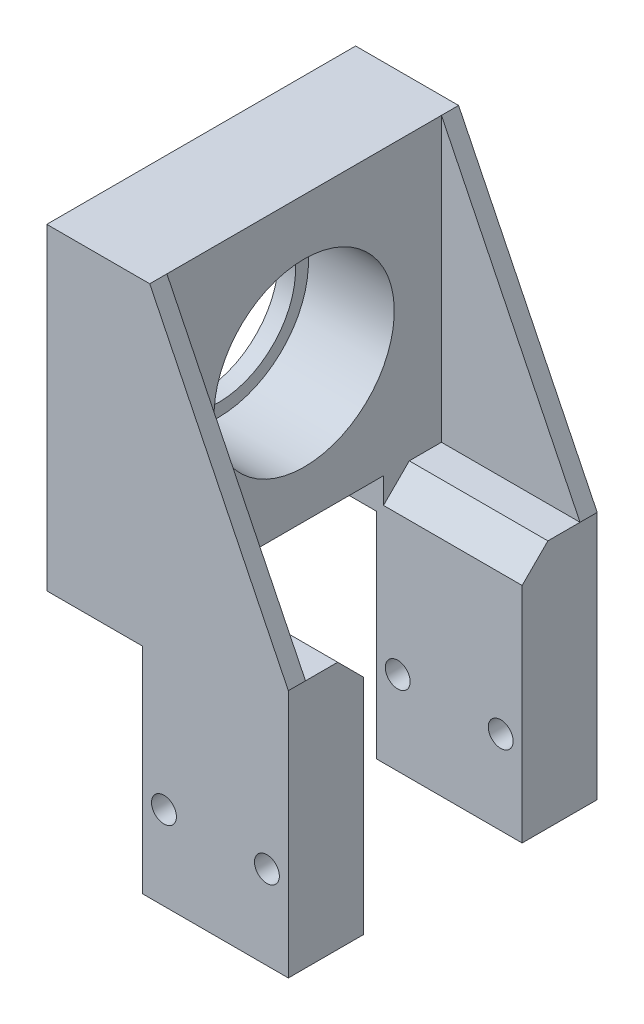
ISO-10303-21;
HEADER;
FILE_DESCRIPTION(('STEP AP214'),'2;1');
FILE_NAME('part.step','',(''),(''),'','','');
FILE_SCHEMA(('AUTOMOTIVE_DESIGN { 1 0 10303 214 1 1 1 1 }'));
ENDSEC;
DATA;
#1=APPLICATION_CONTEXT('core data for automotive mechanical design processes');
#2=APPLICATION_PROTOCOL_DEFINITION('international standard','automotive_design',2000,#1);
#3=PRODUCT_CONTEXT('',#1,'mechanical');
#4=PRODUCT('Part','Part','',(#3));
#5=PRODUCT_RELATED_PRODUCT_CATEGORY('part','',(#4));
#6=PRODUCT_DEFINITION_FORMATION('','',#4);
#7=PRODUCT_DEFINITION_CONTEXT('part definition',#1,'design');
#8=PRODUCT_DEFINITION('design','',#6,#7);
#9=PRODUCT_DEFINITION_SHAPE('','',#8);
#10=(LENGTH_UNIT() NAMED_UNIT(*) SI_UNIT(.MILLI.,.METRE.));
#11=(NAMED_UNIT(*) PLANE_ANGLE_UNIT() SI_UNIT($,.RADIAN.));
#12=(NAMED_UNIT(*) SI_UNIT($,.STERADIAN.) SOLID_ANGLE_UNIT());
#13=UNCERTAINTY_MEASURE_WITH_UNIT(LENGTH_MEASURE(1.E-05),#10,'distance_accuracy_value','');
#14=(GEOMETRIC_REPRESENTATION_CONTEXT(3) GLOBAL_UNCERTAINTY_ASSIGNED_CONTEXT((#13)) GLOBAL_UNIT_ASSIGNED_CONTEXT((#10,
#11,#12)) REPRESENTATION_CONTEXT('',''));
#15=CARTESIAN_POINT('',(0.,0.,0.));
#16=DIRECTION('',(0.,0.,1.));
#17=DIRECTION('',(1.,0.,0.));
#18=AXIS2_PLACEMENT_3D('',#15,#16,#17);
#19=CARTESIAN_POINT('',(-11.1565585331453,62.,36.));
#20=DIRECTION('',(1.,0.,0.));
#21=DIRECTION('',(0.,1.,0.));
#22=AXIS2_PLACEMENT_3D('',#19,#20,#21);
#23=PLANE('',#22);
#24=CARTESIAN_POINT('',(-11.1565585331453,45.,18.));
#25=DIRECTION('',(-1.,0.,0.));
#26=DIRECTION('',(0.,-1.,0.));
#27=AXIS2_PLACEMENT_3D('',#24,#25,#26);
#28=CIRCLE('',#27,9.);
#29=CARTESIAN_POINT('',(-11.1565585331453,36.,18.));
#30=VERTEX_POINT('',#29);
#31=EDGE_CURVE('E370',#30,#30,#28,.T.);
#32=ORIENTED_EDGE('',*,*,#31,.F.);
#33=EDGE_LOOP('',(#32));
#34=FACE_BOUND('',#33,.T.);
#35=CARTESIAN_POINT('',(-11.1565585331453,45.,18.));
#36=DIRECTION('',(-1.,0.,0.));
#37=DIRECTION('',(0.,-1.,0.));
#38=AXIS2_PLACEMENT_3D('',#35,#36,#37);
#39=CIRCLE('',#38,11.);
#40=CARTESIAN_POINT('',(-11.1565585331453,34.,18.));
#41=VERTEX_POINT('',#40);
#42=EDGE_CURVE('E411',#41,#41,#39,.T.);
#43=ORIENTED_EDGE('',*,*,#42,.T.);
#44=EDGE_LOOP('',(#43));
#45=FACE_BOUND('',#44,.T.);
#46=ADVANCED_FACE('F47',(#34,#45),#23,.F.);
#47=CARTESIAN_POINT('',(-11.1565585331453,45.,18.));
#48=DIRECTION('',(1.,0.,0.));
#49=DIRECTION('',(0.,1.,0.));
#50=AXIS2_PLACEMENT_3D('',#47,#48,#49);
#51=CYLINDRICAL_SURFACE('',#50,10.5);
#52=CARTESIAN_POINT('',(0.843441466854715,45.,18.));
#53=DIRECTION('',(1.,0.,0.));
#54=DIRECTION('',(0.,1.,0.));
#55=AXIS2_PLACEMENT_3D('',#52,#53,#54);
#56=CIRCLE('',#55,10.5);
#57=CARTESIAN_POINT('',(0.843441466854713,55.5,18.));
#58=VERTEX_POINT('',#57);
#59=EDGE_CURVE('E279',#58,#58,#56,.T.);
#60=ORIENTED_EDGE('',*,*,#59,.T.);
#61=EDGE_LOOP('',(#60));
#62=FACE_BOUND('',#61,.T.);
#63=CARTESIAN_POINT('',(-9.15655853314528,45.,18.));
#64=DIRECTION('',(-1.,0.,0.));
#65=DIRECTION('',(0.,-1.,0.));
#66=AXIS2_PLACEMENT_3D('',#63,#64,#65);
#67=CIRCLE('',#66,10.5);
#68=CARTESIAN_POINT('',(-9.15655853314528,34.5,18.));
#69=VERTEX_POINT('',#68);
#70=EDGE_CURVE('E11',#69,#69,#67,.F.);
#71=ORIENTED_EDGE('',*,*,#70,.F.);
#72=EDGE_LOOP('',(#71));
#73=FACE_BOUND('',#72,.T.);
#74=ADVANCED_FACE('F481',(#62,#73),#51,.F.);
#75=CARTESIAN_POINT('',(0.843441466854722,29.,36.));
#76=DIRECTION('',(-1.,0.,0.));
#77=DIRECTION('',(0.,0.,1.));
#78=AXIS2_PLACEMENT_3D('',#75,#76,#77);
#79=PLANE('',#78);
#80=ORIENTED_EDGE('',*,*,#59,.F.);
#81=EDGE_LOOP('',(#80));
#82=FACE_BOUND('',#81,.T.);
#83=DIRECTION('',(0.,-1.,0.));
#84=VECTOR('',#83,1.);
#85=CARTESIAN_POINT('',(0.843441466854722,29.,2.));
#86=LINE('',#85,#84);
#87=CARTESIAN_POINT('',(0.843441466854722,62.,2.));
#88=VERTEX_POINT('',#87);
#89=CARTESIAN_POINT('',(0.843441466854722,29.,2.));
#90=VERTEX_POINT('',#89);
#91=EDGE_CURVE('E350',#88,#90,#86,.T.);
#92=ORIENTED_EDGE('',*,*,#91,.F.);
#93=DIRECTION('',(0.,0.,-1.));
#94=VECTOR('',#93,1.);
#95=CARTESIAN_POINT('',(0.843441466854722,62.,36.));
#96=LINE('',#95,#94);
#97=CARTESIAN_POINT('',(0.843441466854722,62.,34.));
#98=VERTEX_POINT('',#97);
#99=EDGE_CURVE('E243',#98,#88,#96,.T.);
#100=ORIENTED_EDGE('',*,*,#99,.F.);
#101=DIRECTION('',(0.,1.,0.));
#102=VECTOR('',#101,1.);
#103=CARTESIAN_POINT('',(0.843441466854722,29.,34.));
#104=LINE('',#103,#102);
#105=CARTESIAN_POINT('',(0.843441466854722,29.,34.));
#106=VERTEX_POINT('',#105);
#107=EDGE_CURVE('E198',#106,#98,#104,.T.);
#108=ORIENTED_EDGE('',*,*,#107,.F.);
#109=DIRECTION('',(0.,0.,-1.));
#110=VECTOR('',#109,1.);
#111=CARTESIAN_POINT('',(0.843441466854722,29.,36.));
#112=LINE('',#111,#110);
#113=CARTESIAN_POINT('',(0.843441466854722,29.,30.25));
#114=VERTEX_POINT('',#113);
#115=EDGE_CURVE('E227',#106,#114,#112,.T.);
#116=ORIENTED_EDGE('',*,*,#115,.T.);
#117=DIRECTION('',(0.,0.707106781186547,0.707106781186548));
#118=VECTOR('',#117,1.);
#119=CARTESIAN_POINT('',(0.843441466854722,31.875,33.125));
#120=LINE('',#119,#118);
#121=CARTESIAN_POINT('',(0.843441466854722,26.,27.25));
#122=VERTEX_POINT('',#121);
#123=EDGE_CURVE('E536',#114,#122,#120,.F.);
#124=ORIENTED_EDGE('',*,*,#123,.T.);
#125=DIRECTION('',(0.,-1.,0.));
#126=VECTOR('',#125,1.);
#127=CARTESIAN_POINT('',(0.843441466854722,0.,27.25));
#128=LINE('',#127,#126);
#129=CARTESIAN_POINT('',(0.843441466854722,29.,27.25));
#130=VERTEX_POINT('',#129);
#131=EDGE_CURVE('E66',#130,#122,#128,.T.);
#132=ORIENTED_EDGE('',*,*,#131,.F.);
#133=DIRECTION('',(0.,0.,-1.));
#134=VECTOR('',#133,1.);
#135=CARTESIAN_POINT('',(0.843441466854722,29.,36.));
#136=LINE('',#135,#134);
#137=CARTESIAN_POINT('',(0.843441466854722,29.,8.75));
#138=VERTEX_POINT('',#137);
#139=EDGE_CURVE('E295',#130,#138,#136,.T.);
#140=ORIENTED_EDGE('',*,*,#139,.T.);
#141=DIRECTION('',(0.,1.,0.));
#142=VECTOR('',#141,1.);
#143=CARTESIAN_POINT('',(0.843441466854722,0.,8.75));
#144=LINE('',#143,#142);
#145=CARTESIAN_POINT('',(0.843441466854722,26.,8.75));
#146=VERTEX_POINT('',#145);
#147=EDGE_CURVE('E72',#146,#138,#144,.T.);
#148=ORIENTED_EDGE('',*,*,#147,.F.);
#149=DIRECTION('',(0.,-0.707106781186548,0.707106781186547));
#150=VECTOR('',#149,1.);
#151=CARTESIAN_POINT('',(0.843441466854722,13.875,20.875));
#152=LINE('',#151,#150);
#153=CARTESIAN_POINT('',(0.843441466854722,29.,5.75));
#154=VERTEX_POINT('',#153);
#155=EDGE_CURVE('E58',#146,#154,#152,.F.);
#156=ORIENTED_EDGE('',*,*,#155,.T.);
#157=EDGE_CURVE('E235',#154,#90,#112,.T.);
#158=ORIENTED_EDGE('',*,*,#157,.T.);
#159=EDGE_LOOP('',(#92,#100,#108,#116,#124,#132,#140,#148,#156,#158));
#160=FACE_BOUND('',#159,.T.);
#161=ADVANCED_FACE('F486',(#82,#160),#79,.F.);
#162=CARTESIAN_POINT('',(17.,29.,36.));
#163=DIRECTION('',(0.,-1.,0.));
#164=DIRECTION('',(0.,0.,-1.));
#165=AXIS2_PLACEMENT_3D('',#162,#163,#164);
#166=PLANE('',#165);
#167=ORIENTED_EDGE('',*,*,#157,.F.);
#168=DIRECTION('',(1.,0.,0.));
#169=VECTOR('',#168,1.);
#170=CARTESIAN_POINT('',(17.,29.,5.75));
#171=LINE('',#170,#169);
#172=CARTESIAN_POINT('',(17.,29.,5.75));
#173=VERTEX_POINT('',#172);
#174=EDGE_CURVE('E553',#154,#173,#171,.T.);
#175=ORIENTED_EDGE('',*,*,#174,.T.);
#176=DIRECTION('',(0.,0.,-1.));
#177=VECTOR('',#176,1.);
#178=CARTESIAN_POINT('',(17.,29.,36.));
#179=LINE('',#178,#177);
#180=CARTESIAN_POINT('',(17.,29.,2.));
#181=VERTEX_POINT('',#180);
#182=EDGE_CURVE('E220',#173,#181,#179,.T.);
#183=ORIENTED_EDGE('',*,*,#182,.T.);
#184=DIRECTION('',(1.,0.,0.));
#185=VECTOR('',#184,1.);
#186=CARTESIAN_POINT('',(17.,29.,2.));
#187=LINE('',#186,#185);
#188=EDGE_CURVE('E345',#90,#181,#187,.T.);
#189=ORIENTED_EDGE('',*,*,#188,.F.);
#190=EDGE_LOOP('',(#167,#175,#183,#189));
#191=FACE_BOUND('',#190,.T.);
#192=ADVANCED_FACE('F500',(#191),#166,.F.);
#193=CARTESIAN_POINT('',(17.,29.,34.));
#194=VERTEX_POINT('',#193);
#195=CARTESIAN_POINT('',(17.,29.,30.25));
#196=VERTEX_POINT('',#195);
#197=EDGE_CURVE('E216',#194,#196,#179,.T.);
#198=ORIENTED_EDGE('',*,*,#197,.T.);
#199=DIRECTION('',(-1.,0.,0.));
#200=VECTOR('',#199,1.);
#201=CARTESIAN_POINT('',(17.,29.,30.25));
#202=LINE('',#201,#200);
#203=EDGE_CURVE('E537',#196,#114,#202,.T.);
#204=ORIENTED_EDGE('',*,*,#203,.T.);
#205=ORIENTED_EDGE('',*,*,#115,.F.);
#206=DIRECTION('',(-1.,0.,0.));
#207=VECTOR('',#206,1.);
#208=CARTESIAN_POINT('',(17.,29.,34.));
#209=LINE('',#208,#207);
#210=EDGE_CURVE('E329',#194,#106,#209,.T.);
#211=ORIENTED_EDGE('',*,*,#210,.F.);
#212=EDGE_LOOP('',(#198,#204,#205,#211));
#213=FACE_BOUND('',#212,.T.);
#214=ADVANCED_FACE('F504',(#213),#166,.F.);
#215=CARTESIAN_POINT('',(0.,25.,36.));
#216=DIRECTION('',(1.,0.,0.));
#217=DIRECTION('',(0.,1.,0.));
#218=AXIS2_PLACEMENT_3D('',#215,#216,#217);
#219=PLANE('',#218);
#220=DIRECTION('',(0.,0.,-1.));
#221=VECTOR('',#220,1.);
#222=CARTESIAN_POINT('',(0.,25.,36.));
#223=LINE('',#222,#221);
#224=CARTESIAN_POINT('',(0.,25.,36.));
#225=VERTEX_POINT('',#224);
#226=CARTESIAN_POINT('',(0.,25.,27.25));
#227=VERTEX_POINT('',#226);
#228=EDGE_CURVE('E251',#225,#227,#223,.T.);
#229=ORIENTED_EDGE('',*,*,#228,.T.);
#230=DIRECTION('',(0.,-1.,0.));
#231=VECTOR('',#230,1.);
#232=CARTESIAN_POINT('',(0.,25.,27.25));
#233=LINE('',#232,#231);
#234=CARTESIAN_POINT('',(0.,0.,27.25));
#235=VERTEX_POINT('',#234);
#236=EDGE_CURVE('E298',#227,#235,#233,.T.);
#237=ORIENTED_EDGE('',*,*,#236,.T.);
#238=DIRECTION('',(0.,0.,-1.));
#239=VECTOR('',#238,1.);
#240=CARTESIAN_POINT('',(0.,0.,36.));
#241=LINE('',#240,#239);
#242=CARTESIAN_POINT('',(0.,0.,36.));
#243=VERTEX_POINT('',#242);
#244=EDGE_CURVE('E571',#243,#235,#241,.T.);
#245=ORIENTED_EDGE('',*,*,#244,.F.);
#246=DIRECTION('',(0.,-1.,0.));
#247=VECTOR('',#246,1.);
#248=CARTESIAN_POINT('',(0.,25.,36.));
#249=LINE('',#248,#247);
#250=EDGE_CURVE('E259',#225,#243,#249,.T.);
#251=ORIENTED_EDGE('',*,*,#250,.F.);
#252=EDGE_LOOP('',(#229,#237,#245,#251));
#253=FACE_BOUND('',#252,.T.);
#254=ADVANCED_FACE('F517',(#253),#219,.F.);
#255=CARTESIAN_POINT('',(0.,0.,36.));
#256=DIRECTION('',(0.,1.,0.));
#257=DIRECTION('',(0.,0.,1.));
#258=AXIS2_PLACEMENT_3D('',#255,#256,#257);
#259=PLANE('',#258);
#260=ORIENTED_EDGE('',*,*,#244,.T.);
#261=DIRECTION('',(1.,0.,0.));
#262=VECTOR('',#261,1.);
#263=CARTESIAN_POINT('',(-11.1565585331453,0.,27.25));
#264=LINE('',#263,#262);
#265=CARTESIAN_POINT('',(17.,0.,27.25));
#266=VERTEX_POINT('',#265);
#267=EDGE_CURVE('E307',#235,#266,#264,.T.);
#268=ORIENTED_EDGE('',*,*,#267,.T.);
#269=DIRECTION('',(0.,0.,-1.));
#270=VECTOR('',#269,1.);
#271=CARTESIAN_POINT('',(17.,0.,36.));
#272=LINE('',#271,#270);
#273=CARTESIAN_POINT('',(17.,0.,36.));
#274=VERTEX_POINT('',#273);
#275=EDGE_CURVE('E223',#274,#266,#272,.T.);
#276=ORIENTED_EDGE('',*,*,#275,.F.);
#277=DIRECTION('',(1.,0.,0.));
#278=VECTOR('',#277,1.);
#279=CARTESIAN_POINT('',(0.,0.,36.));
#280=LINE('',#279,#278);
#281=EDGE_CURVE('E205',#243,#274,#280,.T.);
#282=ORIENTED_EDGE('',*,*,#281,.F.);
#283=EDGE_LOOP('',(#260,#268,#276,#282));
#284=FACE_BOUND('',#283,.T.);
#285=ADVANCED_FACE('F513',(#284),#259,.F.);
#286=CARTESIAN_POINT('',(17.,0.,36.));
#287=DIRECTION('',(-1.,0.,0.));
#288=DIRECTION('',(0.,0.,1.));
#289=AXIS2_PLACEMENT_3D('',#286,#287,#288);
#290=PLANE('',#289);
#291=DIRECTION('',(0.,-1.,0.));
#292=VECTOR('',#291,1.);
#293=CARTESIAN_POINT('',(17.,0.,27.25));
#294=LINE('',#293,#292);
#295=CARTESIAN_POINT('',(17.,26.,27.25));
#296=VERTEX_POINT('',#295);
#297=EDGE_CURVE('E326',#296,#266,#294,.T.);
#298=ORIENTED_EDGE('',*,*,#297,.F.);
#299=DIRECTION('',(0.,-0.707106781186547,-0.707106781186548));
#300=VECTOR('',#299,1.);
#301=CARTESIAN_POINT('',(17.,26.,27.25));
#302=LINE('',#301,#300);
#303=EDGE_CURVE('E558',#296,#196,#302,.F.);
#304=ORIENTED_EDGE('',*,*,#303,.T.);
#305=ORIENTED_EDGE('',*,*,#197,.F.);
#306=CARTESIAN_POINT('',(17.,29.,36.));
#307=VERTEX_POINT('',#306);
#308=EDGE_CURVE('E191',#307,#194,#179,.T.);
#309=ORIENTED_EDGE('',*,*,#308,.F.);
#310=DIRECTION('',(0.,1.,0.));
#311=VECTOR('',#310,1.);
#312=CARTESIAN_POINT('',(17.,0.,36.));
#313=LINE('',#312,#311);
#314=EDGE_CURVE('E202',#274,#307,#313,.T.);
#315=ORIENTED_EDGE('',*,*,#314,.F.);
#316=ORIENTED_EDGE('',*,*,#275,.T.);
#317=EDGE_LOOP('',(#298,#304,#305,#309,#315,#316));
#318=FACE_BOUND('',#317,.T.);
#319=ADVANCED_FACE('F214',(#318),#290,.F.);
#320=CARTESIAN_POINT('',(-11.1565585331453,25.,36.));
#321=DIRECTION('',(0.,1.,0.));
#322=DIRECTION('',(0.,0.,1.));
#323=AXIS2_PLACEMENT_3D('',#320,#321,#322);
#324=PLANE('',#323);
#325=DIRECTION('',(0.,0.,-1.));
#326=VECTOR('',#325,1.);
#327=CARTESIAN_POINT('',(-11.1565585331453,25.,36.));
#328=LINE('',#327,#326);
#329=CARTESIAN_POINT('',(-11.1565585331453,25.,36.));
#330=VERTEX_POINT('',#329);
#331=CARTESIAN_POINT('',(-11.1565585331453,25.,27.25));
#332=VERTEX_POINT('',#331);
#333=EDGE_CURVE('E247',#330,#332,#328,.T.);
#334=ORIENTED_EDGE('',*,*,#333,.T.);
#335=DIRECTION('',(1.,0.,0.));
#336=VECTOR('',#335,1.);
#337=CARTESIAN_POINT('',(-11.1565585331453,25.,27.25));
#338=LINE('',#337,#336);
#339=EDGE_CURVE('E565',#332,#227,#338,.T.);
#340=ORIENTED_EDGE('',*,*,#339,.T.);
#341=ORIENTED_EDGE('',*,*,#228,.F.);
#342=DIRECTION('',(1.,0.,0.));
#343=VECTOR('',#342,1.);
#344=CARTESIAN_POINT('',(-11.1565585331453,25.,36.));
#345=LINE('',#344,#343);
#346=EDGE_CURVE('E280',#330,#225,#345,.T.);
#347=ORIENTED_EDGE('',*,*,#346,.F.);
#348=EDGE_LOOP('',(#334,#340,#341,#347));
#349=FACE_BOUND('',#348,.T.);
#350=ADVANCED_FACE('F515',(#349),#324,.F.);
#351=DIRECTION('',(0.,-1.,0.));
#352=VECTOR('',#351,1.);
#353=CARTESIAN_POINT('',(0.,25.,0.));
#354=LINE('',#353,#352);
#355=CARTESIAN_POINT('',(0.,25.,0.));
#356=VERTEX_POINT('',#355);
#357=CARTESIAN_POINT('',(0.,0.,0.));
#358=VERTEX_POINT('',#357);
#359=EDGE_CURVE('E275',#356,#358,#354,.T.);
#360=ORIENTED_EDGE('',*,*,#359,.T.);
#361=CARTESIAN_POINT('',(0.,0.,8.75));
#362=VERTEX_POINT('',#361);
#363=EDGE_CURVE('E573',#362,#358,#241,.T.);
#364=ORIENTED_EDGE('',*,*,#363,.F.);
#365=DIRECTION('',(0.,1.,0.));
#366=VECTOR('',#365,1.);
#367=CARTESIAN_POINT('',(0.,25.,8.75));
#368=LINE('',#367,#366);
#369=CARTESIAN_POINT('',(0.,25.,8.75));
#370=VERTEX_POINT('',#369);
#371=EDGE_CURVE('E302',#362,#370,#368,.T.);
#372=ORIENTED_EDGE('',*,*,#371,.T.);
#373=EDGE_CURVE('E254',#370,#356,#223,.T.);
#374=ORIENTED_EDGE('',*,*,#373,.T.);
#375=EDGE_LOOP('',(#360,#364,#372,#374));
#376=FACE_BOUND('',#375,.T.);
#377=ADVANCED_FACE('F511',(#376),#219,.F.);
#378=DIRECTION('',(1.,0.,0.));
#379=VECTOR('',#378,1.);
#380=CARTESIAN_POINT('',(0.,0.,0.));
#381=LINE('',#380,#379);
#382=CARTESIAN_POINT('',(17.,0.,0.));
#383=VERTEX_POINT('',#382);
#384=EDGE_CURVE('E271',#358,#383,#381,.T.);
#385=ORIENTED_EDGE('',*,*,#384,.T.);
#386=CARTESIAN_POINT('',(17.,0.,8.75));
#387=VERTEX_POINT('',#386);
#388=EDGE_CURVE('E218',#387,#383,#272,.T.);
#389=ORIENTED_EDGE('',*,*,#388,.F.);
#390=DIRECTION('',(1.,0.,0.));
#391=VECTOR('',#390,1.);
#392=CARTESIAN_POINT('',(-11.1565585331453,0.,8.75));
#393=LINE('',#392,#391);
#394=EDGE_CURVE('E311',#362,#387,#393,.T.);
#395=ORIENTED_EDGE('',*,*,#394,.F.);
#396=ORIENTED_EDGE('',*,*,#363,.T.);
#397=EDGE_LOOP('',(#385,#389,#395,#396));
#398=FACE_BOUND('',#397,.T.);
#399=ADVANCED_FACE('F507',(#398),#259,.F.);
#400=ORIENTED_EDGE('',*,*,#182,.F.);
#401=DIRECTION('',(0.,0.707106781186548,-0.707106781186547));
#402=VECTOR('',#401,1.);
#403=CARTESIAN_POINT('',(17.,29.,5.75));
#404=LINE('',#403,#402);
#405=CARTESIAN_POINT('',(17.,26.,8.75));
#406=VERTEX_POINT('',#405);
#407=EDGE_CURVE('E550',#173,#406,#404,.F.);
#408=ORIENTED_EDGE('',*,*,#407,.T.);
#409=DIRECTION('',(0.,1.,0.));
#410=VECTOR('',#409,1.);
#411=CARTESIAN_POINT('',(17.,0.,8.75));
#412=LINE('',#411,#410);
#413=EDGE_CURVE('E321',#387,#406,#412,.T.);
#414=ORIENTED_EDGE('',*,*,#413,.F.);
#415=ORIENTED_EDGE('',*,*,#388,.T.);
#416=DIRECTION('',(0.,1.,0.));
#417=VECTOR('',#416,1.);
#418=CARTESIAN_POINT('',(17.,0.,0.));
#419=LINE('',#418,#417);
#420=CARTESIAN_POINT('',(17.,29.,0.));
#421=VERTEX_POINT('',#420);
#422=EDGE_CURVE('E268',#383,#421,#419,.T.);
#423=ORIENTED_EDGE('',*,*,#422,.T.);
#424=DIRECTION('',(0.,0.,1.));
#425=VECTOR('',#424,1.);
#426=CARTESIAN_POINT('',(17.,29.,36.));
#427=LINE('',#426,#425);
#428=EDGE_CURVE('E354',#421,#181,#427,.T.);
#429=ORIENTED_EDGE('',*,*,#428,.T.);
#430=EDGE_LOOP('',(#400,#408,#414,#415,#423,#429));
#431=FACE_BOUND('',#430,.T.);
#432=ADVANCED_FACE('F496',(#431),#290,.F.);
#433=CARTESIAN_POINT('',(0.843441466854722,62.,36.));
#434=DIRECTION('',(0.,-1.,0.));
#435=DIRECTION('',(0.,0.,-1.));
#436=AXIS2_PLACEMENT_3D('',#433,#434,#435);
#437=PLANE('',#436);
#438=DIRECTION('',(-1.,0.,0.));
#439=VECTOR('',#438,1.);
#440=CARTESIAN_POINT('',(0.843441466854722,62.,0.));
#441=LINE('',#440,#439);
#442=CARTESIAN_POINT('',(0.843441466854722,62.,0.));
#443=VERTEX_POINT('',#442);
#444=CARTESIAN_POINT('',(-11.1565585331453,62.,0.));
#445=VERTEX_POINT('',#444);
#446=EDGE_CURVE('E264',#443,#445,#441,.T.);
#447=ORIENTED_EDGE('',*,*,#446,.T.);
#448=DIRECTION('',(0.,0.,-1.));
#449=VECTOR('',#448,1.);
#450=CARTESIAN_POINT('',(-11.1565585331453,62.,36.));
#451=LINE('',#450,#449);
#452=CARTESIAN_POINT('',(-11.1565585331453,62.,36.));
#453=VERTEX_POINT('',#452);
#454=EDGE_CURVE('E244',#453,#445,#451,.T.);
#455=ORIENTED_EDGE('',*,*,#454,.F.);
#456=DIRECTION('',(-1.,0.,0.));
#457=VECTOR('',#456,1.);
#458=CARTESIAN_POINT('',(0.843441466854722,62.,36.));
#459=LINE('',#458,#457);
#460=CARTESIAN_POINT('',(0.843441466854722,62.,36.));
#461=VERTEX_POINT('',#460);
#462=EDGE_CURVE('E210',#461,#453,#459,.T.);
#463=ORIENTED_EDGE('',*,*,#462,.F.);
#464=EDGE_CURVE('E194',#461,#98,#96,.T.);
#465=ORIENTED_EDGE('',*,*,#464,.T.);
#466=ORIENTED_EDGE('',*,*,#99,.T.);
#467=DIRECTION('',(0.,0.,1.));
#468=VECTOR('',#467,1.);
#469=CARTESIAN_POINT('',(0.843441466854722,62.,36.));
#470=LINE('',#469,#468);
#471=EDGE_CURVE('E357',#443,#88,#470,.T.);
#472=ORIENTED_EDGE('',*,*,#471,.F.);
#473=EDGE_LOOP('',(#447,#455,#463,#465,#466,#472));
#474=FACE_BOUND('',#473,.T.);
#475=ADVANCED_FACE('F439',(#474),#437,.F.);
#476=CARTESIAN_POINT('',(-11.1565585331453,45.,18.));
#477=DIRECTION('',(-1.,0.,0.));
#478=DIRECTION('',(0.,-1.,0.));
#479=AXIS2_PLACEMENT_3D('',#476,#477,#478);
#480=CIRCLE('',#479,15.);
#481=CARTESIAN_POINT('',(-11.1565585331453,30.,18.));
#482=VERTEX_POINT('',#481);
#483=EDGE_CURVE('E403',#482,#482,#480,.T.);
#484=ORIENTED_EDGE('',*,*,#483,.F.);
#485=EDGE_LOOP('',(#484));
#486=FACE_BOUND('',#485,.T.);
#487=DIRECTION('',(0.,-1.,0.));
#488=VECTOR('',#487,1.);
#489=CARTESIAN_POINT('',(-11.1565585331453,62.,0.));
#490=LINE('',#489,#488);
#491=CARTESIAN_POINT('',(-11.1565585331453,25.,0.));
#492=VERTEX_POINT('',#491);
#493=EDGE_CURVE('E260',#445,#492,#490,.T.);
#494=ORIENTED_EDGE('',*,*,#493,.T.);
#495=CARTESIAN_POINT('',(-11.1565585331453,25.,8.75));
#496=VERTEX_POINT('',#495);
#497=EDGE_CURVE('E250',#496,#492,#328,.T.);
#498=ORIENTED_EDGE('',*,*,#497,.F.);
#499=DIRECTION('',(0.,1.,0.));
#500=VECTOR('',#499,1.);
#501=CARTESIAN_POINT('',(-11.1565585331453,0.,8.75));
#502=LINE('',#501,#500);
#503=CARTESIAN_POINT('',(-11.1565585331453,29.,8.75));
#504=VERTEX_POINT('',#503);
#505=EDGE_CURVE('E333',#496,#504,#502,.T.);
#506=ORIENTED_EDGE('',*,*,#505,.T.);
#507=DIRECTION('',(0.,0.,1.));
#508=VECTOR('',#507,1.);
#509=CARTESIAN_POINT('',(-11.1565585331453,29.,27.25));
#510=LINE('',#509,#508);
#511=CARTESIAN_POINT('',(-11.1565585331453,29.,27.25));
#512=VERTEX_POINT('',#511);
#513=EDGE_CURVE('E312',#504,#512,#510,.T.);
#514=ORIENTED_EDGE('',*,*,#513,.T.);
#515=DIRECTION('',(0.,-1.,0.));
#516=VECTOR('',#515,1.);
#517=CARTESIAN_POINT('',(-11.1565585331453,0.,27.25));
#518=LINE('',#517,#516);
#519=EDGE_CURVE('E325',#512,#332,#518,.T.);
#520=ORIENTED_EDGE('',*,*,#519,.T.);
#521=ORIENTED_EDGE('',*,*,#333,.F.);
#522=DIRECTION('',(0.,-1.,0.));
#523=VECTOR('',#522,1.);
#524=CARTESIAN_POINT('',(-11.1565585331453,62.,36.));
#525=LINE('',#524,#523);
#526=EDGE_CURVE('E283',#453,#330,#525,.T.);
#527=ORIENTED_EDGE('',*,*,#526,.F.);
#528=ORIENTED_EDGE('',*,*,#454,.T.);
#529=EDGE_LOOP('',(#494,#498,#506,#514,#520,#521,#527,#528));
#530=FACE_BOUND('',#529,.T.);
#531=ADVANCED_FACE('F435',(#486,#530),#23,.F.);
#532=DIRECTION('',(1.,0.,0.));
#533=VECTOR('',#532,1.);
#534=CARTESIAN_POINT('',(-11.1565585331453,25.,0.));
#535=LINE('',#534,#533);
#536=EDGE_CURVE('E255',#492,#356,#535,.T.);
#537=ORIENTED_EDGE('',*,*,#536,.T.);
#538=ORIENTED_EDGE('',*,*,#373,.F.);
#539=DIRECTION('',(-1.,0.,0.));
#540=VECTOR('',#539,1.);
#541=CARTESIAN_POINT('',(-11.1565585331453,25.,8.75));
#542=LINE('',#541,#540);
#543=EDGE_CURVE('E454',#370,#496,#542,.T.);
#544=ORIENTED_EDGE('',*,*,#543,.T.);
#545=ORIENTED_EDGE('',*,*,#497,.T.);
#546=EDGE_LOOP('',(#537,#538,#544,#545));
#547=FACE_BOUND('',#546,.T.);
#548=ADVANCED_FACE('F438',(#547),#324,.F.);
#549=CARTESIAN_POINT('',(0.,0.,36.));
#550=DIRECTION('',(0.,0.,1.));
#551=DIRECTION('',(1.,0.,0.));
#552=AXIS2_PLACEMENT_3D('',#549,#550,#551);
#553=PLANE('',#552);
#554=CARTESIAN_POINT('',(2.5,9.75,36.));
#555=DIRECTION('',(0.,0.,1.));
#556=DIRECTION('',(1.,0.,0.));
#557=AXIS2_PLACEMENT_3D('',#554,#555,#556);
#558=CIRCLE('',#557,1.45);
#559=CARTESIAN_POINT('',(3.95,9.75,36.));
#560=VERTEX_POINT('',#559);
#561=EDGE_CURVE('E398',#560,#560,#558,.T.);
#562=ORIENTED_EDGE('',*,*,#561,.F.);
#563=EDGE_LOOP('',(#562));
#564=FACE_BOUND('',#563,.T.);
#565=CARTESIAN_POINT('',(14.5,9.75,36.));
#566=DIRECTION('',(0.,0.,1.));
#567=DIRECTION('',(1.,0.,0.));
#568=AXIS2_PLACEMENT_3D('',#565,#566,#567);
#569=CIRCLE('',#568,1.44999999999999);
#570=CARTESIAN_POINT('',(15.95,9.75,36.));
#571=VERTEX_POINT('',#570);
#572=EDGE_CURVE('E386',#571,#571,#569,.T.);
#573=ORIENTED_EDGE('',*,*,#572,.F.);
#574=EDGE_LOOP('',(#573));
#575=FACE_BOUND('',#574,.T.);
#576=ORIENTED_EDGE('',*,*,#250,.T.);
#577=ORIENTED_EDGE('',*,*,#281,.T.);
#578=ORIENTED_EDGE('',*,*,#314,.T.);
#579=DIRECTION('',(0.439720227068504,-0.898134801634378,0.));
#580=VECTOR('',#579,1.);
#581=CARTESIAN_POINT('',(0.843441466854722,62.,36.));
#582=LINE('',#581,#580);
#583=EDGE_CURVE('E186',#461,#307,#582,.T.);
#584=ORIENTED_EDGE('',*,*,#583,.F.);
#585=ORIENTED_EDGE('',*,*,#462,.T.);
#586=ORIENTED_EDGE('',*,*,#526,.T.);
#587=ORIENTED_EDGE('',*,*,#346,.T.);
#588=EDGE_LOOP('',(#576,#577,#578,#584,#585,#586,#587));
#589=FACE_BOUND('',#588,.T.);
#590=ADVANCED_FACE('F204',(#564,#575,#589),#553,.T.);
#591=CARTESIAN_POINT('',(0.,0.,0.));
#592=DIRECTION('',(0.,0.,1.));
#593=DIRECTION('',(1.,0.,0.));
#594=AXIS2_PLACEMENT_3D('',#591,#592,#593);
#595=PLANE('',#594);
#596=CARTESIAN_POINT('',(2.5,9.75,0.));
#597=DIRECTION('',(0.,0.,1.));
#598=DIRECTION('',(1.,0.,0.));
#599=AXIS2_PLACEMENT_3D('',#596,#597,#598);
#600=CIRCLE('',#599,1.44999999999999);
#601=CARTESIAN_POINT('',(3.94999999999999,9.75,0.));
#602=VERTEX_POINT('',#601);
#603=EDGE_CURVE('E394',#602,#602,#600,.T.);
#604=ORIENTED_EDGE('',*,*,#603,.T.);
#605=EDGE_LOOP('',(#604));
#606=FACE_BOUND('',#605,.T.);
#607=CARTESIAN_POINT('',(14.5,9.75,0.));
#608=DIRECTION('',(0.,0.,1.));
#609=DIRECTION('',(1.,0.,0.));
#610=AXIS2_PLACEMENT_3D('',#607,#608,#609);
#611=CIRCLE('',#610,1.44999999999999);
#612=CARTESIAN_POINT('',(15.95,9.75,0.));
#613=VERTEX_POINT('',#612);
#614=EDGE_CURVE('E382',#613,#613,#611,.T.);
#615=ORIENTED_EDGE('',*,*,#614,.T.);
#616=EDGE_LOOP('',(#615));
#617=FACE_BOUND('',#616,.T.);
#618=ORIENTED_EDGE('',*,*,#446,.F.);
#619=DIRECTION('',(0.439720227068504,-0.898134801634378,0.));
#620=VECTOR('',#619,1.);
#621=CARTESIAN_POINT('',(0.843441466854722,62.,0.));
#622=LINE('',#621,#620);
#623=EDGE_CURVE('E361',#443,#421,#622,.T.);
#624=ORIENTED_EDGE('',*,*,#623,.T.);
#625=ORIENTED_EDGE('',*,*,#422,.F.);
#626=ORIENTED_EDGE('',*,*,#384,.F.);
#627=ORIENTED_EDGE('',*,*,#359,.F.);
#628=ORIENTED_EDGE('',*,*,#536,.F.);
#629=ORIENTED_EDGE('',*,*,#493,.F.);
#630=EDGE_LOOP('',(#618,#624,#625,#626,#627,#628,#629));
#631=FACE_BOUND('',#630,.T.);
#632=ADVANCED_FACE('F449',(#606,#617,#631),#595,.F.);
#633=CARTESIAN_POINT('',(-11.1565585331453,29.,27.25));
#634=DIRECTION('',(0.,1.,0.));
#635=DIRECTION('',(0.,0.,1.));
#636=AXIS2_PLACEMENT_3D('',#633,#634,#635);
#637=PLANE('',#636);
#638=DIRECTION('',(1.,0.,0.));
#639=VECTOR('',#638,1.);
#640=CARTESIAN_POINT('',(-11.1565585331453,29.,27.25));
#641=LINE('',#640,#639);
#642=EDGE_CURVE('E306',#512,#130,#641,.T.);
#643=ORIENTED_EDGE('',*,*,#642,.F.);
#644=ORIENTED_EDGE('',*,*,#513,.F.);
#645=DIRECTION('',(1.,0.,0.));
#646=VECTOR('',#645,1.);
#647=CARTESIAN_POINT('',(-11.1565585331453,29.,8.75));
#648=LINE('',#647,#646);
#649=EDGE_CURVE('E315',#504,#138,#648,.T.);
#650=ORIENTED_EDGE('',*,*,#649,.T.);
#651=ORIENTED_EDGE('',*,*,#139,.F.);
#652=EDGE_LOOP('',(#643,#644,#650,#651));
#653=FACE_BOUND('',#652,.T.);
#654=ADVANCED_FACE('F586',(#653),#637,.F.);
#655=CARTESIAN_POINT('',(-11.1565585331453,0.,27.25));
#656=DIRECTION('',(0.,0.,1.));
#657=DIRECTION('',(1.,0.,0.));
#658=AXIS2_PLACEMENT_3D('',#655,#656,#657);
#659=PLANE('',#658);
#660=CARTESIAN_POINT('',(2.5,9.75,27.25));
#661=DIRECTION('',(0.,0.,1.));
#662=DIRECTION('',(1.,0.,0.));
#663=AXIS2_PLACEMENT_3D('',#660,#661,#662);
#664=CIRCLE('',#663,1.44999999999999);
#665=CARTESIAN_POINT('',(3.95,9.75,27.25));
#666=VERTEX_POINT('',#665);
#667=EDGE_CURVE('E390',#666,#666,#664,.T.);
#668=ORIENTED_EDGE('',*,*,#667,.T.);
#669=EDGE_LOOP('',(#668));
#670=FACE_BOUND('',#669,.T.);
#671=CARTESIAN_POINT('',(14.5,9.75,27.25));
#672=DIRECTION('',(0.,0.,1.));
#673=DIRECTION('',(1.,0.,0.));
#674=AXIS2_PLACEMENT_3D('',#671,#672,#673);
#675=CIRCLE('',#674,1.44999999999999);
#676=CARTESIAN_POINT('',(15.95,9.75,27.25));
#677=VERTEX_POINT('',#676);
#678=EDGE_CURVE('E374',#677,#677,#675,.T.);
#679=ORIENTED_EDGE('',*,*,#678,.T.);
#680=EDGE_LOOP('',(#679));
#681=FACE_BOUND('',#680,.T.);
#682=ORIENTED_EDGE('',*,*,#131,.T.);
#683=DIRECTION('',(1.,0.,0.));
#684=VECTOR('',#683,1.);
#685=CARTESIAN_POINT('',(-11.1565585331453,26.,27.25));
#686=LINE('',#685,#684);
#687=EDGE_CURVE('E539',#122,#296,#686,.T.);
#688=ORIENTED_EDGE('',*,*,#687,.T.);
#689=ORIENTED_EDGE('',*,*,#297,.T.);
#690=ORIENTED_EDGE('',*,*,#267,.F.);
#691=ORIENTED_EDGE('',*,*,#236,.F.);
#692=ORIENTED_EDGE('',*,*,#339,.F.);
#693=ORIENTED_EDGE('',*,*,#519,.F.);
#694=ORIENTED_EDGE('',*,*,#642,.T.);
#695=EDGE_LOOP('',(#682,#688,#689,#690,#691,#692,#693,#694));
#696=FACE_BOUND('',#695,.T.);
#697=ADVANCED_FACE('F590',(#670,#681,#696),#659,.F.);
#698=CARTESIAN_POINT('',(-11.1565585331453,0.,8.75));
#699=DIRECTION('',(0.,0.,-1.));
#700=DIRECTION('',(-1.,0.,0.));
#701=AXIS2_PLACEMENT_3D('',#698,#699,#700);
#702=PLANE('',#701);
#703=CARTESIAN_POINT('',(2.5,9.75,8.75));
#704=DIRECTION('',(0.,0.,-1.));
#705=DIRECTION('',(-1.,0.,0.));
#706=AXIS2_PLACEMENT_3D('',#703,#704,#705);
#707=CIRCLE('',#706,1.44999999999999);
#708=CARTESIAN_POINT('',(1.05000000000001,9.75,8.75));
#709=VERTEX_POINT('',#708);
#710=EDGE_CURVE('E52',#709,#709,#707,.T.);
#711=ORIENTED_EDGE('',*,*,#710,.T.);
#712=EDGE_LOOP('',(#711));
#713=FACE_BOUND('',#712,.T.);
#714=CARTESIAN_POINT('',(14.5,9.75,8.75));
#715=DIRECTION('',(0.,0.,-1.));
#716=DIRECTION('',(-1.,0.,0.));
#717=AXIS2_PLACEMENT_3D('',#714,#715,#716);
#718=CIRCLE('',#717,1.44999999999999);
#719=CARTESIAN_POINT('',(13.05,9.75,8.75));
#720=VERTEX_POINT('',#719);
#721=EDGE_CURVE('E381',#720,#720,#718,.T.);
#722=ORIENTED_EDGE('',*,*,#721,.T.);
#723=EDGE_LOOP('',(#722));
#724=FACE_BOUND('',#723,.T.);
#725=ORIENTED_EDGE('',*,*,#413,.T.);
#726=DIRECTION('',(-1.,0.,0.));
#727=VECTOR('',#726,1.);
#728=CARTESIAN_POINT('',(-11.1565585331453,26.,8.75));
#729=LINE('',#728,#727);
#730=EDGE_CURVE('E541',#406,#146,#729,.T.);
#731=ORIENTED_EDGE('',*,*,#730,.T.);
#732=ORIENTED_EDGE('',*,*,#147,.T.);
#733=ORIENTED_EDGE('',*,*,#649,.F.);
#734=ORIENTED_EDGE('',*,*,#505,.F.);
#735=ORIENTED_EDGE('',*,*,#543,.F.);
#736=ORIENTED_EDGE('',*,*,#371,.F.);
#737=ORIENTED_EDGE('',*,*,#394,.T.);
#738=EDGE_LOOP('',(#725,#731,#732,#733,#734,#735,#736,#737));
#739=FACE_BOUND('',#738,.T.);
#740=ADVANCED_FACE('F463',(#713,#724,#739),#702,.F.);
#741=CARTESIAN_POINT('',(2.92172073342736,31.,34.));
#742=DIRECTION('',(0.,0.,1.));
#743=DIRECTION('',(1.,0.,0.));
#744=AXIS2_PLACEMENT_3D('',#741,#742,#743);
#745=PLANE('',#744);
#746=DIRECTION('',(0.439720227068504,-0.898134801634378,0.));
#747=VECTOR('',#746,1.);
#748=CARTESIAN_POINT('',(0.843441466854722,62.,34.));
#749=LINE('',#748,#747);
#750=EDGE_CURVE('E199',#98,#194,#749,.T.);
#751=ORIENTED_EDGE('',*,*,#750,.T.);
#752=ORIENTED_EDGE('',*,*,#210,.T.);
#753=ORIENTED_EDGE('',*,*,#107,.T.);
#754=EDGE_LOOP('',(#751,#752,#753));
#755=FACE_BOUND('',#754,.T.);
#756=ADVANCED_FACE('F611',(#755),#745,.F.);
#757=CARTESIAN_POINT('',(0.843441466854722,62.,36.));
#758=DIRECTION('',(-0.898134801634378,-0.439720227068504,0.));
#759=DIRECTION('',(0.439720227068504,-0.898134801634378,0.));
#760=AXIS2_PLACEMENT_3D('',#757,#758,#759);
#761=PLANE('',#760);
#762=ORIENTED_EDGE('',*,*,#308,.T.);
#763=ORIENTED_EDGE('',*,*,#750,.F.);
#764=ORIENTED_EDGE('',*,*,#464,.F.);
#765=ORIENTED_EDGE('',*,*,#583,.T.);
#766=EDGE_LOOP('',(#762,#763,#764,#765));
#767=FACE_BOUND('',#766,.T.);
#768=ADVANCED_FACE('F188',(#767),#761,.F.);
#769=CARTESIAN_POINT('',(2.92172073342736,31.,2.));
#770=DIRECTION('',(0.,0.,-1.));
#771=DIRECTION('',(-1.,0.,0.));
#772=AXIS2_PLACEMENT_3D('',#769,#770,#771);
#773=PLANE('',#772);
#774=ORIENTED_EDGE('',*,*,#91,.T.);
#775=ORIENTED_EDGE('',*,*,#188,.T.);
#776=DIRECTION('',(0.439720227068504,-0.898134801634378,0.));
#777=VECTOR('',#776,1.);
#778=CARTESIAN_POINT('',(0.843441466854722,62.,2.));
#779=LINE('',#778,#777);
#780=EDGE_CURVE('E362',#88,#181,#779,.T.);
#781=ORIENTED_EDGE('',*,*,#780,.F.);
#782=EDGE_LOOP('',(#774,#775,#781));
#783=FACE_BOUND('',#782,.T.);
#784=ADVANCED_FACE('F531',(#783),#773,.F.);
#785=CARTESIAN_POINT('',(0.843441466854722,62.,0.));
#786=DIRECTION('',(0.898134801634378,0.439720227068504,0.));
#787=DIRECTION('',(0.439720227068504,-0.898134801634378,0.));
#788=AXIS2_PLACEMENT_3D('',#785,#786,#787);
#789=PLANE('',#788);
#790=ORIENTED_EDGE('',*,*,#428,.F.);
#791=ORIENTED_EDGE('',*,*,#623,.F.);
#792=ORIENTED_EDGE('',*,*,#471,.T.);
#793=ORIENTED_EDGE('',*,*,#780,.T.);
#794=EDGE_LOOP('',(#790,#791,#792,#793));
#795=FACE_BOUND('',#794,.T.);
#796=ADVANCED_FACE('F523',(#795),#789,.T.);
#797=CARTESIAN_POINT('',(-11.1565585331453,26.,27.25));
#798=DIRECTION('',(0.,-0.707106781186548,0.707106781186547));
#799=DIRECTION('',(1.,0.,0.));
#800=AXIS2_PLACEMENT_3D('',#797,#798,#799);
#801=PLANE('',#800);
#802=ORIENTED_EDGE('',*,*,#123,.F.);
#803=ORIENTED_EDGE('',*,*,#203,.F.);
#804=ORIENTED_EDGE('',*,*,#303,.F.);
#805=ORIENTED_EDGE('',*,*,#687,.F.);
#806=EDGE_LOOP('',(#802,#803,#804,#805));
#807=FACE_BOUND('',#806,.T.);
#808=ADVANCED_FACE('F519',(#807),#801,.F.);
#809=CARTESIAN_POINT('',(17.,29.,5.75));
#810=DIRECTION('',(0.,-0.707106781186547,-0.707106781186548));
#811=DIRECTION('',(1.,0.,0.));
#812=AXIS2_PLACEMENT_3D('',#809,#810,#811);
#813=PLANE('',#812);
#814=ORIENTED_EDGE('',*,*,#155,.F.);
#815=ORIENTED_EDGE('',*,*,#730,.F.);
#816=ORIENTED_EDGE('',*,*,#407,.F.);
#817=ORIENTED_EDGE('',*,*,#174,.F.);
#818=EDGE_LOOP('',(#814,#815,#816,#817));
#819=FACE_BOUND('',#818,.T.);
#820=ADVANCED_FACE('F50',(#819),#813,.F.);
#821=CARTESIAN_POINT('',(-9.15655853314528,45.,18.));
#822=DIRECTION('',(-1.,0.,0.));
#823=DIRECTION('',(0.,-1.,0.));
#824=AXIS2_PLACEMENT_3D('',#821,#822,#823);
#825=PLANE('',#824);
#826=CARTESIAN_POINT('',(-9.15655853314528,45.,18.));
#827=DIRECTION('',(-1.,0.,0.));
#828=DIRECTION('',(0.,-1.,0.));
#829=AXIS2_PLACEMENT_3D('',#826,#827,#828);
#830=CIRCLE('',#829,9.);
#831=CARTESIAN_POINT('',(-9.15655853314528,36.,18.));
#832=VERTEX_POINT('',#831);
#833=EDGE_CURVE('E366',#832,#832,#830,.T.);
#834=ORIENTED_EDGE('',*,*,#833,.T.);
#835=EDGE_LOOP('',(#834));
#836=FACE_BOUND('',#835,.T.);
#837=ORIENTED_EDGE('',*,*,#70,.T.);
#838=EDGE_LOOP('',(#837));
#839=FACE_BOUND('',#838,.T.);
#840=ADVANCED_FACE('F528',(#836,#839),#825,.F.);
#841=CARTESIAN_POINT('',(-9.15655853314528,45.,18.));
#842=DIRECTION('',(-1.,0.,0.));
#843=DIRECTION('',(0.,-1.,0.));
#844=AXIS2_PLACEMENT_3D('',#841,#842,#843);
#845=CYLINDRICAL_SURFACE('',#844,9.);
#846=ORIENTED_EDGE('',*,*,#833,.F.);
#847=EDGE_LOOP('',(#846));
#848=FACE_BOUND('',#847,.T.);
#849=ORIENTED_EDGE('',*,*,#31,.T.);
#850=EDGE_LOOP('',(#849));
#851=FACE_BOUND('',#850,.T.);
#852=ADVANCED_FACE('F639',(#848,#851),#845,.F.);
#853=CARTESIAN_POINT('',(14.5,9.75,36.));
#854=DIRECTION('',(0.,0.,1.));
#855=DIRECTION('',(1.,0.,0.));
#856=AXIS2_PLACEMENT_3D('',#853,#854,#855);
#857=CYLINDRICAL_SURFACE('',#856,1.44999999999999);
#858=ORIENTED_EDGE('',*,*,#614,.F.);
#859=EDGE_LOOP('',(#858));
#860=FACE_BOUND('',#859,.T.);
#861=ORIENTED_EDGE('',*,*,#721,.F.);
#862=EDGE_LOOP('',(#861));
#863=FACE_BOUND('',#862,.T.);
#864=ADVANCED_FACE('F476',(#860,#863),#857,.F.);
#865=ORIENTED_EDGE('',*,*,#572,.T.);
#866=EDGE_LOOP('',(#865));
#867=FACE_BOUND('',#866,.T.);
#868=ORIENTED_EDGE('',*,*,#678,.F.);
#869=EDGE_LOOP('',(#868));
#870=FACE_BOUND('',#869,.T.);
#871=ADVANCED_FACE('F468',(#867,#870),#857,.F.);
#872=CARTESIAN_POINT('',(2.5,9.75,36.));
#873=DIRECTION('',(0.,0.,1.));
#874=DIRECTION('',(1.,0.,0.));
#875=AXIS2_PLACEMENT_3D('',#872,#873,#874);
#876=CYLINDRICAL_SURFACE('',#875,1.44999999999999);
#877=ORIENTED_EDGE('',*,*,#603,.F.);
#878=EDGE_LOOP('',(#877));
#879=FACE_BOUND('',#878,.T.);
#880=ORIENTED_EDGE('',*,*,#710,.F.);
#881=EDGE_LOOP('',(#880));
#882=FACE_BOUND('',#881,.T.);
#883=ADVANCED_FACE('F466',(#879,#882),#876,.F.);
#884=ORIENTED_EDGE('',*,*,#561,.T.);
#885=EDGE_LOOP('',(#884));
#886=FACE_BOUND('',#885,.T.);
#887=ORIENTED_EDGE('',*,*,#667,.F.);
#888=EDGE_LOOP('',(#887));
#889=FACE_BOUND('',#888,.T.);
#890=ADVANCED_FACE('F431',(#886,#889),#876,.F.);
#891=CARTESIAN_POINT('',(-10.5565585331453,45.,18.));
#892=DIRECTION('',(-1.,0.,0.));
#893=DIRECTION('',(0.,-1.,0.));
#894=AXIS2_PLACEMENT_3D('',#891,#892,#893);
#895=CYLINDRICAL_SURFACE('',#894,15.);
#896=CARTESIAN_POINT('',(-10.5565585331453,45.,18.));
#897=DIRECTION('',(-1.,0.,0.));
#898=DIRECTION('',(0.,-1.,0.));
#899=AXIS2_PLACEMENT_3D('',#896,#897,#898);
#900=CIRCLE('',#899,15.);
#901=CARTESIAN_POINT('',(-10.5565585331453,30.,18.));
#902=VERTEX_POINT('',#901);
#903=EDGE_CURVE('E402',#902,#902,#900,.T.);
#904=ORIENTED_EDGE('',*,*,#903,.F.);
#905=EDGE_LOOP('',(#904));
#906=FACE_BOUND('',#905,.T.);
#907=ORIENTED_EDGE('',*,*,#483,.T.);
#908=EDGE_LOOP('',(#907));
#909=FACE_BOUND('',#908,.T.);
#910=ADVANCED_FACE('F425',(#906,#909),#895,.F.);
#911=CARTESIAN_POINT('',(-10.5565585331453,45.,18.));
#912=DIRECTION('',(-1.,0.,0.));
#913=DIRECTION('',(0.,-1.,0.));
#914=AXIS2_PLACEMENT_3D('',#911,#912,#913);
#915=PLANE('',#914);
#916=CARTESIAN_POINT('',(-10.5565585331453,45.,18.));
#917=DIRECTION('',(-1.,0.,0.));
#918=DIRECTION('',(0.,-1.,0.));
#919=AXIS2_PLACEMENT_3D('',#916,#917,#918);
#920=CIRCLE('',#919,11.);
#921=CARTESIAN_POINT('',(-10.5565585331453,34.,18.));
#922=VERTEX_POINT('',#921);
#923=EDGE_CURVE('E407',#922,#922,#920,.T.);
#924=ORIENTED_EDGE('',*,*,#923,.F.);
#925=EDGE_LOOP('',(#924));
#926=FACE_BOUND('',#925,.T.);
#927=ORIENTED_EDGE('',*,*,#903,.T.);
#928=EDGE_LOOP('',(#927));
#929=FACE_BOUND('',#928,.T.);
#930=ADVANCED_FACE('F422',(#926,#929),#915,.T.);
#931=CARTESIAN_POINT('',(-10.5565585331453,45.,18.));
#932=DIRECTION('',(-1.,0.,0.));
#933=DIRECTION('',(0.,-1.,0.));
#934=AXIS2_PLACEMENT_3D('',#931,#932,#933);
#935=CYLINDRICAL_SURFACE('',#934,11.);
#936=ORIENTED_EDGE('',*,*,#923,.T.);
#937=EDGE_LOOP('',(#936));
#938=FACE_BOUND('',#937,.T.);
#939=ORIENTED_EDGE('',*,*,#42,.F.);
#940=EDGE_LOOP('',(#939));
#941=FACE_BOUND('',#940,.T.);
#942=ADVANCED_FACE('F419',(#938,#941),#935,.T.);
#943=CLOSED_SHELL('',(#46,#74,#161,#192,#214,#254,#285,#319,#350,#377,#399,#432,#475,#531,#548,
#590,#632,#654,#697,#740,#756,#768,#784,#796,#808,#820,#840,#852,#864,#871,#883,#890,#910,#930,#942));
#944=MANIFOLD_SOLID_BREP('B2',#943);
#945=ADVANCED_BREP_SHAPE_REPRESENTATION('',(#18,#944),#14);
#946=SHAPE_DEFINITION_REPRESENTATION(#9,#945);
ENDSEC;
END-ISO-10303-21;
